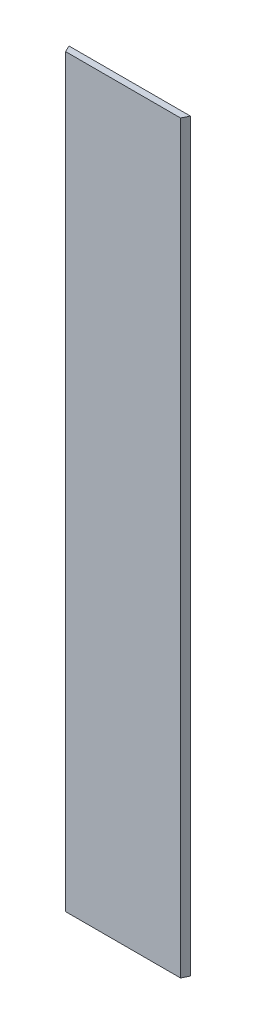
ISO-10303-21;
HEADER;
FILE_DESCRIPTION(('STEP AP214'),'2;1');
FILE_NAME('part.step','',(''),(''),'','','');
FILE_SCHEMA(('AUTOMOTIVE_DESIGN { 1 0 10303 214 1 1 1 1 }'));
ENDSEC;
DATA;
#1=APPLICATION_CONTEXT('core data for automotive mechanical design processes');
#2=APPLICATION_PROTOCOL_DEFINITION('international standard','automotive_design',2000,#1);
#3=PRODUCT_CONTEXT('',#1,'mechanical');
#4=PRODUCT('Part','Part','',(#3));
#5=PRODUCT_RELATED_PRODUCT_CATEGORY('part','',(#4));
#6=PRODUCT_DEFINITION_FORMATION('','',#4);
#7=PRODUCT_DEFINITION_CONTEXT('part definition',#1,'design');
#8=PRODUCT_DEFINITION('design','',#6,#7);
#9=PRODUCT_DEFINITION_SHAPE('','',#8);
#10=(LENGTH_UNIT() NAMED_UNIT(*) SI_UNIT(.MILLI.,.METRE.));
#11=(NAMED_UNIT(*) PLANE_ANGLE_UNIT() SI_UNIT($,.RADIAN.));
#12=(NAMED_UNIT(*) SI_UNIT($,.STERADIAN.) SOLID_ANGLE_UNIT());
#13=UNCERTAINTY_MEASURE_WITH_UNIT(LENGTH_MEASURE(1.E-05),#10,'distance_accuracy_value','');
#14=(GEOMETRIC_REPRESENTATION_CONTEXT(3) GLOBAL_UNCERTAINTY_ASSIGNED_CONTEXT((#13)) GLOBAL_UNIT_ASSIGNED_CONTEXT((#10,
#11,#12)) REPRESENTATION_CONTEXT('',''));
#15=CARTESIAN_POINT('',(0.,0.,0.));
#16=DIRECTION('',(0.,0.,1.));
#17=DIRECTION('',(1.,0.,0.));
#18=AXIS2_PLACEMENT_3D('',#15,#16,#17);
#19=CARTESIAN_POINT('',(0.,539.75,0.));
#20=DIRECTION('',(0.,-1.,0.));
#21=DIRECTION('',(0.,0.,-1.));
#22=AXIS2_PLACEMENT_3D('',#19,#20,#21);
#23=CYLINDRICAL_SURFACE('',#22,47.6885);
#24=CARTESIAN_POINT('',(0.,0.,0.));
#25=DIRECTION('',(0.,1.,0.));
#26=DIRECTION('',(0.,0.,-1.));
#27=AXIS2_PLACEMENT_3D('',#24,#25,#26);
#28=CIRCLE('',#27,47.6885);
#29=CARTESIAN_POINT('',(-43.9389774807847,0.,18.5353524431853));
#30=VERTEX_POINT('',#29);
#31=CARTESIAN_POINT('',(-41.610132225043,0.,23.2978524431853));
#32=VERTEX_POINT('',#31);
#33=EDGE_CURVE('E100',#30,#32,#28,.T.);
#34=ORIENTED_EDGE('',*,*,#33,.T.);
#35=DIRECTION('',(0.,-1.,0.));
#36=VECTOR('',#35,1.);
#37=CARTESIAN_POINT('',(-41.610132225043,539.75,23.2978524431853));
#38=LINE('',#37,#36);
#39=CARTESIAN_POINT('',(-41.610132225043,539.75,23.2978524431853));
#40=VERTEX_POINT('',#39);
#41=EDGE_CURVE('E11',#40,#32,#38,.T.);
#42=ORIENTED_EDGE('',*,*,#41,.F.);
#43=CARTESIAN_POINT('',(0.,539.75,0.));
#44=DIRECTION('',(0.,1.,0.));
#45=DIRECTION('',(0.,0.,-1.));
#46=AXIS2_PLACEMENT_3D('',#43,#44,#45);
#47=CIRCLE('',#46,47.6885);
#48=CARTESIAN_POINT('',(-43.9389774807847,539.75,18.5353524431853));
#49=VERTEX_POINT('',#48);
#50=EDGE_CURVE('E88',#49,#40,#47,.T.);
#51=ORIENTED_EDGE('',*,*,#50,.F.);
#52=DIRECTION('',(0.,-1.,0.));
#53=VECTOR('',#52,1.);
#54=CARTESIAN_POINT('',(-43.9389774807847,539.75,18.5353524431853));
#55=LINE('',#54,#53);
#56=EDGE_CURVE('E96',#49,#30,#55,.T.);
#57=ORIENTED_EDGE('',*,*,#56,.T.);
#58=EDGE_LOOP('',(#34,#42,#51,#57));
#59=FACE_BOUND('',#58,.T.);
#60=ADVANCED_FACE('F37',(#59),#23,.T.);
#61=CARTESIAN_POINT('',(-41.610132225043,539.75,23.2978524431853));
#62=DIRECTION('',(0.,0.,-1.));
#63=DIRECTION('',(-1.,0.,0.));
#64=AXIS2_PLACEMENT_3D('',#61,#62,#63);
#65=PLANE('',#64);
#66=DIRECTION('',(1.,0.,0.));
#67=VECTOR('',#66,1.);
#68=CARTESIAN_POINT('',(-41.610132225043,0.,23.2978524431853));
#69=LINE('',#68,#67);
#70=CARTESIAN_POINT('',(41.610132225043,0.,23.2978524431853));
#71=VERTEX_POINT('',#70);
#72=EDGE_CURVE('E92',#32,#71,#69,.T.);
#73=ORIENTED_EDGE('',*,*,#72,.T.);
#74=DIRECTION('',(0.,-1.,0.));
#75=VECTOR('',#74,1.);
#76=CARTESIAN_POINT('',(41.610132225043,539.75,23.2978524431853));
#77=LINE('',#76,#75);
#78=CARTESIAN_POINT('',(41.610132225043,539.75,23.2978524431853));
#79=VERTEX_POINT('',#78);
#80=EDGE_CURVE('E45',#79,#71,#77,.T.);
#81=ORIENTED_EDGE('',*,*,#80,.F.);
#82=DIRECTION('',(1.,0.,0.));
#83=VECTOR('',#82,1.);
#84=CARTESIAN_POINT('',(-41.610132225043,539.75,23.2978524431853));
#85=LINE('',#84,#83);
#86=EDGE_CURVE('E83',#40,#79,#85,.T.);
#87=ORIENTED_EDGE('',*,*,#86,.F.);
#88=ORIENTED_EDGE('',*,*,#41,.T.);
#89=EDGE_LOOP('',(#73,#81,#87,#88));
#90=FACE_BOUND('',#89,.T.);
#91=ADVANCED_FACE('F91',(#90),#65,.F.);
#92=CARTESIAN_POINT('',(0.,539.75,0.));
#93=DIRECTION('',(0.,-1.,0.));
#94=DIRECTION('',(0.,0.,-1.));
#95=AXIS2_PLACEMENT_3D('',#92,#93,#94);
#96=CYLINDRICAL_SURFACE('',#95,47.6885);
#97=CARTESIAN_POINT('',(0.,0.,0.));
#98=DIRECTION('',(0.,1.,0.));
#99=DIRECTION('',(0.,0.,1.));
#100=AXIS2_PLACEMENT_3D('',#97,#98,#99);
#101=CIRCLE('',#100,47.6885);
#102=CARTESIAN_POINT('',(43.9389774807847,0.,18.5353524431853));
#103=VERTEX_POINT('',#102);
#104=EDGE_CURVE('E70',#71,#103,#101,.T.);
#105=ORIENTED_EDGE('',*,*,#104,.T.);
#106=DIRECTION('',(0.,-1.,0.));
#107=VECTOR('',#106,1.);
#108=CARTESIAN_POINT('',(43.9389774807847,539.75,18.5353524431853));
#109=LINE('',#108,#107);
#110=CARTESIAN_POINT('',(43.9389774807847,539.75,18.5353524431853));
#111=VERTEX_POINT('',#110);
#112=EDGE_CURVE('E93',#111,#103,#109,.T.);
#113=ORIENTED_EDGE('',*,*,#112,.F.);
#114=CARTESIAN_POINT('',(0.,539.75,0.));
#115=DIRECTION('',(0.,1.,0.));
#116=DIRECTION('',(0.,0.,1.));
#117=AXIS2_PLACEMENT_3D('',#114,#115,#116);
#118=CIRCLE('',#117,47.6885);
#119=EDGE_CURVE('E86',#79,#111,#118,.T.);
#120=ORIENTED_EDGE('',*,*,#119,.F.);
#121=ORIENTED_EDGE('',*,*,#80,.T.);
#122=EDGE_LOOP('',(#105,#113,#120,#121));
#123=FACE_BOUND('',#122,.T.);
#124=ADVANCED_FACE('F94',(#123),#96,.T.);
#125=CARTESIAN_POINT('',(-43.9389774807847,539.75,18.5353524431853));
#126=DIRECTION('',(0.,0.,1.));
#127=DIRECTION('',(1.,0.,0.));
#128=AXIS2_PLACEMENT_3D('',#125,#126,#127);
#129=PLANE('',#128);
#130=DIRECTION('',(-1.,0.,0.));
#131=VECTOR('',#130,1.);
#132=CARTESIAN_POINT('',(-43.9389774807847,0.,18.5353524431853));
#133=LINE('',#132,#131);
#134=EDGE_CURVE('E76',#103,#30,#133,.T.);
#135=ORIENTED_EDGE('',*,*,#134,.T.);
#136=ORIENTED_EDGE('',*,*,#56,.F.);
#137=DIRECTION('',(-1.,0.,0.));
#138=VECTOR('',#137,1.);
#139=CARTESIAN_POINT('',(-43.9389774807847,539.75,18.5353524431853));
#140=LINE('',#139,#138);
#141=EDGE_CURVE('E53',#111,#49,#140,.T.);
#142=ORIENTED_EDGE('',*,*,#141,.F.);
#143=ORIENTED_EDGE('',*,*,#112,.T.);
#144=EDGE_LOOP('',(#135,#136,#142,#143));
#145=FACE_BOUND('',#144,.T.);
#146=ADVANCED_FACE('F107',(#145),#129,.F.);
#147=CARTESIAN_POINT('',(0.,539.75,0.));
#148=DIRECTION('',(0.,-1.,0.));
#149=DIRECTION('',(0.,0.,-1.));
#150=AXIS2_PLACEMENT_3D('',#147,#148,#149);
#151=PLANE('',#150);
#152=ORIENTED_EDGE('',*,*,#50,.T.);
#153=ORIENTED_EDGE('',*,*,#86,.T.);
#154=ORIENTED_EDGE('',*,*,#119,.T.);
#155=ORIENTED_EDGE('',*,*,#141,.T.);
#156=EDGE_LOOP('',(#152,#153,#154,#155));
#157=FACE_BOUND('',#156,.T.);
#158=ADVANCED_FACE('F84',(#157),#151,.F.);
#159=CARTESIAN_POINT('',(0.,0.,0.));
#160=DIRECTION('',(0.,-1.,0.));
#161=DIRECTION('',(0.,0.,-1.));
#162=AXIS2_PLACEMENT_3D('',#159,#160,#161);
#163=PLANE('',#162);
#164=ORIENTED_EDGE('',*,*,#33,.F.);
#165=ORIENTED_EDGE('',*,*,#134,.F.);
#166=ORIENTED_EDGE('',*,*,#104,.F.);
#167=ORIENTED_EDGE('',*,*,#72,.F.);
#168=EDGE_LOOP('',(#164,#165,#166,#167));
#169=FACE_BOUND('',#168,.T.);
#170=ADVANCED_FACE('F110',(#169),#163,.T.);
#171=CLOSED_SHELL('',(#60,#91,#124,#146,#158,#170));
#172=MANIFOLD_SOLID_BREP('B2',#171);
#173=ADVANCED_BREP_SHAPE_REPRESENTATION('',(#18,#172),#14);
#174=SHAPE_DEFINITION_REPRESENTATION(#9,#173);
ENDSEC;
END-ISO-10303-21;
